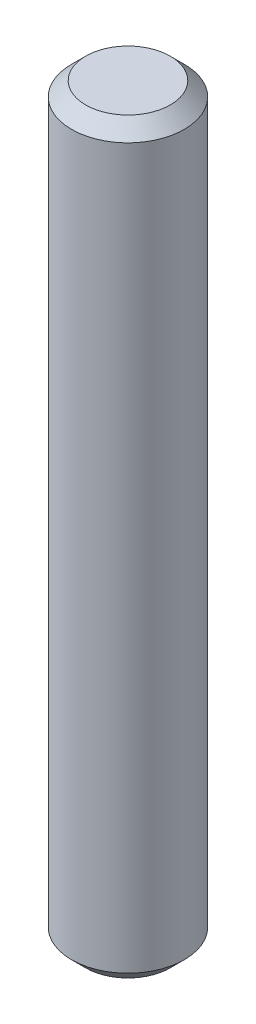
ISO-10303-21;
HEADER;
FILE_DESCRIPTION(('STEP AP214'),'2;1');
FILE_NAME('part.step','',(''),(''),'','','');
FILE_SCHEMA(('AUTOMOTIVE_DESIGN { 1 0 10303 214 1 1 1 1 }'));
ENDSEC;
DATA;
#1=APPLICATION_CONTEXT('core data for automotive mechanical design processes');
#2=APPLICATION_PROTOCOL_DEFINITION('international standard','automotive_design',2000,#1);
#3=PRODUCT_CONTEXT('',#1,'mechanical');
#4=PRODUCT('Part','Part','',(#3));
#5=PRODUCT_RELATED_PRODUCT_CATEGORY('part','',(#4));
#6=PRODUCT_DEFINITION_FORMATION('','',#4);
#7=PRODUCT_DEFINITION_CONTEXT('part definition',#1,'design');
#8=PRODUCT_DEFINITION('design','',#6,#7);
#9=PRODUCT_DEFINITION_SHAPE('','',#8);
#10=(LENGTH_UNIT() NAMED_UNIT(*) SI_UNIT(.MILLI.,.METRE.));
#11=(NAMED_UNIT(*) PLANE_ANGLE_UNIT() SI_UNIT($,.RADIAN.));
#12=(NAMED_UNIT(*) SI_UNIT($,.STERADIAN.) SOLID_ANGLE_UNIT());
#13=UNCERTAINTY_MEASURE_WITH_UNIT(LENGTH_MEASURE(1.E-05),#10,'distance_accuracy_value','');
#14=(GEOMETRIC_REPRESENTATION_CONTEXT(3) GLOBAL_UNCERTAINTY_ASSIGNED_CONTEXT((#13)) GLOBAL_UNIT_ASSIGNED_CONTEXT((#10,
#11,#12)) REPRESENTATION_CONTEXT('',''));
#15=CARTESIAN_POINT('',(0.,0.,0.));
#16=DIRECTION('',(0.,0.,1.));
#17=DIRECTION('',(1.,0.,0.));
#18=AXIS2_PLACEMENT_3D('',#15,#16,#17);
#19=CARTESIAN_POINT('',(0.,53.,0.));
#20=DIRECTION('',(0.,-1.,0.));
#21=DIRECTION('',(0.,0.,-1.));
#22=AXIS2_PLACEMENT_3D('',#19,#20,#21);
#23=CYLINDRICAL_SURFACE('',#22,4.);
#24=CARTESIAN_POINT('',(0.,1.00000000000001,0.));
#25=DIRECTION('',(0.,1.,0.));
#26=DIRECTION('',(0.,0.,1.));
#27=AXIS2_PLACEMENT_3D('',#24,#25,#26);
#28=CIRCLE('',#27,4.);
#29=CARTESIAN_POINT('',(0.,1.00000000000001,4.));
#30=VERTEX_POINT('',#29);
#31=EDGE_CURVE('E42',#30,#30,#28,.T.);
#32=ORIENTED_EDGE('',*,*,#31,.T.);
#33=EDGE_LOOP('',(#32));
#34=FACE_BOUND('',#33,.T.);
#35=CARTESIAN_POINT('',(0.,52.,0.));
#36=DIRECTION('',(0.,1.,0.));
#37=DIRECTION('',(0.,0.,1.));
#38=AXIS2_PLACEMENT_3D('',#35,#36,#37);
#39=CIRCLE('',#38,4.);
#40=CARTESIAN_POINT('',(0.,52.,4.));
#41=VERTEX_POINT('',#40);
#42=EDGE_CURVE('E46',#41,#41,#39,.F.);
#43=ORIENTED_EDGE('',*,*,#42,.T.);
#44=EDGE_LOOP('',(#43));
#45=FACE_BOUND('',#44,.T.);
#46=ADVANCED_FACE('F31',(#34,#45),#23,.T.);
#47=CARTESIAN_POINT('',(0.,53.,0.));
#48=DIRECTION('',(0.,1.,0.));
#49=DIRECTION('',(0.,0.,1.));
#50=AXIS2_PLACEMENT_3D('',#47,#48,#49);
#51=PLANE('',#50);
#52=CARTESIAN_POINT('',(0.,53.,0.));
#53=DIRECTION('',(0.,1.,0.));
#54=DIRECTION('',(0.,0.,1.));
#55=AXIS2_PLACEMENT_3D('',#52,#53,#54);
#56=CIRCLE('',#55,3.00000000000001);
#57=CARTESIAN_POINT('',(0.,53.,3.00000000000001));
#58=VERTEX_POINT('',#57);
#59=EDGE_CURVE('E10',#58,#58,#56,.T.);
#60=ORIENTED_EDGE('',*,*,#59,.T.);
#61=EDGE_LOOP('',(#60));
#62=FACE_BOUND('',#61,.T.);
#63=ADVANCED_FACE('F62',(#62),#51,.T.);
#64=CARTESIAN_POINT('',(0.,0.,0.));
#65=DIRECTION('',(0.,1.,0.));
#66=DIRECTION('',(0.,0.,1.));
#67=AXIS2_PLACEMENT_3D('',#64,#65,#66);
#68=PLANE('',#67);
#69=CARTESIAN_POINT('',(0.,0.,0.));
#70=DIRECTION('',(0.,1.,0.));
#71=DIRECTION('',(0.,0.,1.));
#72=AXIS2_PLACEMENT_3D('',#69,#70,#71);
#73=CIRCLE('',#72,2.99999999999999);
#74=CARTESIAN_POINT('',(0.,0.,2.99999999999999));
#75=VERTEX_POINT('',#74);
#76=EDGE_CURVE('E38',#75,#75,#73,.F.);
#77=ORIENTED_EDGE('',*,*,#76,.T.);
#78=EDGE_LOOP('',(#77));
#79=FACE_BOUND('',#78,.T.);
#80=ADVANCED_FACE('F59',(#79),#68,.F.);
#81=CARTESIAN_POINT('',(0.,1.00000000000001,0.));
#82=DIRECTION('',(0.,1.,0.));
#83=DIRECTION('',(0.,0.,1.));
#84=AXIS2_PLACEMENT_3D('',#81,#82,#83);
#85=CONICAL_SURFACE('',#84,4.,0.78539816339745);
#86=ORIENTED_EDGE('',*,*,#76,.F.);
#87=EDGE_LOOP('',(#86));
#88=FACE_BOUND('',#87,.T.);
#89=ORIENTED_EDGE('',*,*,#31,.F.);
#90=EDGE_LOOP('',(#89));
#91=FACE_BOUND('',#90,.T.);
#92=ADVANCED_FACE('F55',(#88,#91),#85,.T.);
#93=CARTESIAN_POINT('',(0.,53.,0.));
#94=DIRECTION('',(0.,-1.,0.));
#95=DIRECTION('',(0.,0.,-1.));
#96=AXIS2_PLACEMENT_3D('',#93,#94,#95);
#97=CONICAL_SURFACE('',#96,3.00000000000001,0.785398163397447);
#98=ORIENTED_EDGE('',*,*,#42,.F.);
#99=EDGE_LOOP('',(#98));
#100=FACE_BOUND('',#99,.T.);
#101=ORIENTED_EDGE('',*,*,#59,.F.);
#102=EDGE_LOOP('',(#101));
#103=FACE_BOUND('',#102,.T.);
#104=ADVANCED_FACE('F33',(#100,#103),#97,.T.);
#105=CLOSED_SHELL('',(#46,#63,#80,#92,#104));
#106=MANIFOLD_SOLID_BREP('B2',#105);
#107=ADVANCED_BREP_SHAPE_REPRESENTATION('',(#18,#106),#14);
#108=SHAPE_DEFINITION_REPRESENTATION(#9,#107);
ENDSEC;
END-ISO-10303-21;
